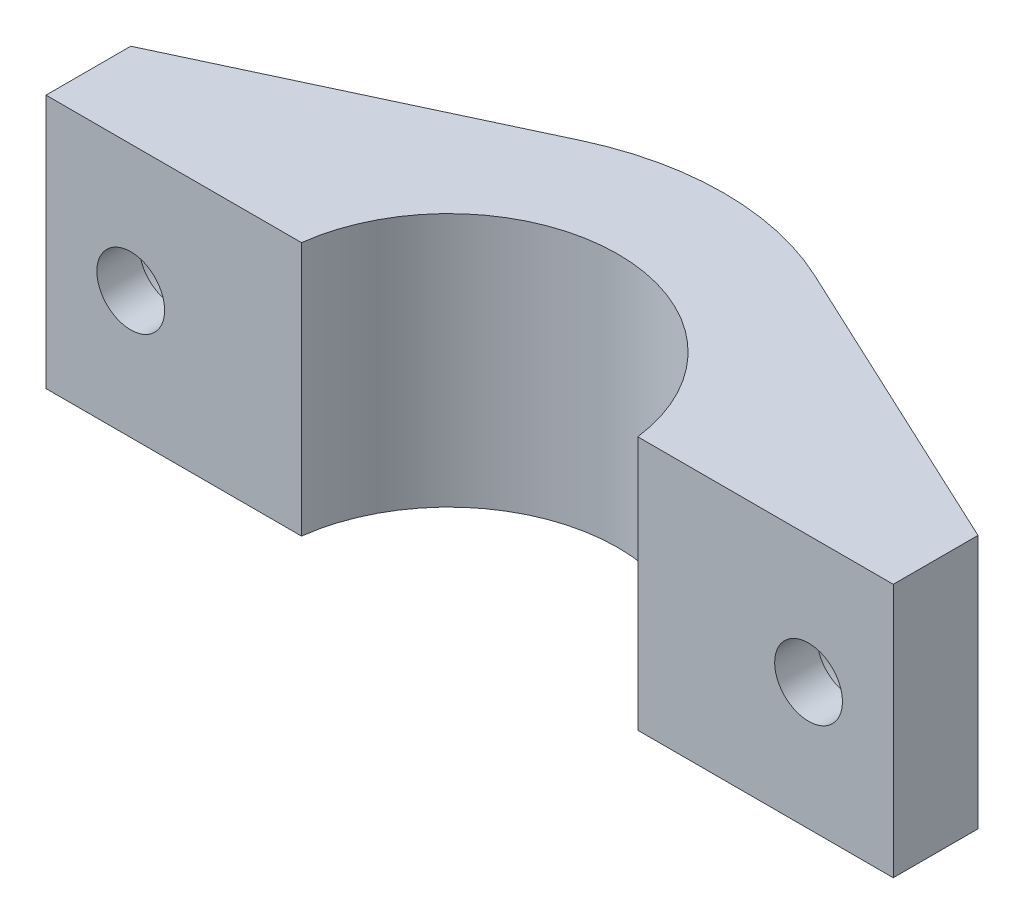
ISO-10303-21;
HEADER;
FILE_DESCRIPTION(('STEP AP214'),'2;1');
FILE_NAME('part.step','',(''),(''),'','','');
FILE_SCHEMA(('AUTOMOTIVE_DESIGN { 1 0 10303 214 1 1 1 1 }'));
ENDSEC;
DATA;
#1=APPLICATION_CONTEXT('core data for automotive mechanical design processes');
#2=APPLICATION_PROTOCOL_DEFINITION('international standard','automotive_design',2000,#1);
#3=PRODUCT_CONTEXT('',#1,'mechanical');
#4=PRODUCT('Part','Part','',(#3));
#5=PRODUCT_RELATED_PRODUCT_CATEGORY('part','',(#4));
#6=PRODUCT_DEFINITION_FORMATION('','',#4);
#7=PRODUCT_DEFINITION_CONTEXT('part definition',#1,'design');
#8=PRODUCT_DEFINITION('design','',#6,#7);
#9=PRODUCT_DEFINITION_SHAPE('','',#8);
#10=(LENGTH_UNIT() NAMED_UNIT(*) SI_UNIT(.MILLI.,.METRE.));
#11=(NAMED_UNIT(*) PLANE_ANGLE_UNIT() SI_UNIT($,.RADIAN.));
#12=(NAMED_UNIT(*) SI_UNIT($,.STERADIAN.) SOLID_ANGLE_UNIT());
#13=UNCERTAINTY_MEASURE_WITH_UNIT(LENGTH_MEASURE(1.E-05),#10,'distance_accuracy_value','');
#14=(GEOMETRIC_REPRESENTATION_CONTEXT(3) GLOBAL_UNCERTAINTY_ASSIGNED_CONTEXT((#13)) GLOBAL_UNIT_ASSIGNED_CONTEXT((#10,
#11,#12)) REPRESENTATION_CONTEXT('',''));
#15=CARTESIAN_POINT('',(0.,0.,0.));
#16=DIRECTION('',(0.,0.,1.));
#17=DIRECTION('',(1.,0.,0.));
#18=AXIS2_PLACEMENT_3D('',#15,#16,#17);
#19=CARTESIAN_POINT('',(0.,12.,-5.));
#20=DIRECTION('',(0.,0.,-1.));
#21=DIRECTION('',(-1.,0.,0.));
#22=AXIS2_PLACEMENT_3D('',#19,#20,#21);
#23=PLANE('',#22);
#24=DIRECTION('',(-1.,0.,0.));
#25=VECTOR('',#24,1.);
#26=CARTESIAN_POINT('',(20.,2.,-4.99999999999999));
#27=LINE('',#26,#25);
#28=CARTESIAN_POINT('',(20.,2.,-4.99999999999999));
#29=VERTEX_POINT('',#28);
#30=CARTESIAN_POINT('',(16.248076809272,2.,-5.));
#31=VERTEX_POINT('',#30);
#32=EDGE_CURVE('E335',#29,#31,#27,.T.);
#33=ORIENTED_EDGE('',*,*,#32,.T.);
#34=DIRECTION('',(0.,1.,0.));
#35=VECTOR('',#34,1.);
#36=CARTESIAN_POINT('',(16.248076809272,12.,-5.00000000000001));
#37=LINE('',#36,#35);
#38=CARTESIAN_POINT('',(16.248076809272,3.01027461182445,-5.00000000000001));
#39=VERTEX_POINT('',#38);
#40=EDGE_CURVE('E226',#31,#39,#37,.T.);
#41=ORIENTED_EDGE('',*,*,#40,.T.);
#42=CARTESIAN_POINT('',(16.,6.,-5.00000000000001));
#43=DIRECTION('',(0.,0.,-1.));
#44=DIRECTION('',(-1.,0.,0.));
#45=AXIS2_PLACEMENT_3D('',#42,#43,#44);
#46=CIRCLE('',#45,3.);
#47=CARTESIAN_POINT('',(16.248076809272,8.98972538817555,-5.00000000000001));
#48=VERTEX_POINT('',#47);
#49=EDGE_CURVE('E236',#48,#39,#46,.T.);
#50=ORIENTED_EDGE('',*,*,#49,.F.);
#51=DIRECTION('',(0.,1.,0.));
#52=VECTOR('',#51,1.);
#53=CARTESIAN_POINT('',(16.248076809272,12.,-5.00000000000001));
#54=LINE('',#53,#52);
#55=CARTESIAN_POINT('',(16.248076809272,10.,-5.));
#56=VERTEX_POINT('',#55);
#57=EDGE_CURVE('E224',#48,#56,#54,.T.);
#58=ORIENTED_EDGE('',*,*,#57,.T.);
#59=DIRECTION('',(-1.,0.,0.));
#60=VECTOR('',#59,1.);
#61=CARTESIAN_POINT('',(20.,10.,-4.99999999999999));
#62=LINE('',#61,#60);
#63=CARTESIAN_POINT('',(20.,10.,-5.00000000000001));
#64=VERTEX_POINT('',#63);
#65=EDGE_CURVE('E253',#64,#56,#62,.T.);
#66=ORIENTED_EDGE('',*,*,#65,.F.);
#67=DIRECTION('',(0.,-1.,0.));
#68=VECTOR('',#67,1.);
#69=CARTESIAN_POINT('',(20.,12.,-5.00000000000001));
#70=LINE('',#69,#68);
#71=EDGE_CURVE('E192',#64,#29,#70,.T.);
#72=ORIENTED_EDGE('',*,*,#71,.T.);
#73=EDGE_LOOP('',(#33,#41,#50,#58,#66,#72));
#74=FACE_BOUND('',#73,.T.);
#75=ADVANCED_FACE('F35',(#74),#23,.T.);
#76=CARTESIAN_POINT('',(0.,12.,-5.));
#77=DIRECTION('',(0.,0.,-1.));
#78=DIRECTION('',(-1.,0.,0.));
#79=AXIS2_PLACEMENT_3D('',#76,#77,#78);
#80=PLANE('',#79);
#81=DIRECTION('',(1.,0.,0.));
#82=VECTOR('',#81,1.);
#83=CARTESIAN_POINT('',(-20.,10.,-4.99999999999999));
#84=LINE('',#83,#82);
#85=CARTESIAN_POINT('',(-20.,10.,-4.99999999999999));
#86=VERTEX_POINT('',#85);
#87=CARTESIAN_POINT('',(-16.2480768092719,10.,-5.));
#88=VERTEX_POINT('',#87);
#89=EDGE_CURVE('E277',#86,#88,#84,.T.);
#90=ORIENTED_EDGE('',*,*,#89,.T.);
#91=DIRECTION('',(0.,-1.,0.));
#92=VECTOR('',#91,1.);
#93=CARTESIAN_POINT('',(-16.2480768092719,12.,-5.));
#94=LINE('',#93,#92);
#95=CARTESIAN_POINT('',(-16.2480768092719,8.98972538817555,-5.));
#96=VERTEX_POINT('',#95);
#97=EDGE_CURVE('E210',#88,#96,#94,.T.);
#98=ORIENTED_EDGE('',*,*,#97,.T.);
#99=CARTESIAN_POINT('',(-16.,6.,-5.));
#100=DIRECTION('',(0.,0.,-1.));
#101=DIRECTION('',(-1.,0.,0.));
#102=AXIS2_PLACEMENT_3D('',#99,#100,#101);
#103=CIRCLE('',#102,3.);
#104=CARTESIAN_POINT('',(-16.2480768092719,3.01027461182445,-5.));
#105=VERTEX_POINT('',#104);
#106=EDGE_CURVE('E291',#105,#96,#103,.T.);
#107=ORIENTED_EDGE('',*,*,#106,.F.);
#108=DIRECTION('',(0.,-1.,0.));
#109=VECTOR('',#108,1.);
#110=CARTESIAN_POINT('',(-16.2480768092719,12.,-5.));
#111=LINE('',#110,#109);
#112=CARTESIAN_POINT('',(-16.2480768092719,2.,-5.));
#113=VERTEX_POINT('',#112);
#114=EDGE_CURVE('E208',#105,#113,#111,.T.);
#115=ORIENTED_EDGE('',*,*,#114,.T.);
#116=DIRECTION('',(1.,0.,0.));
#117=VECTOR('',#116,1.);
#118=CARTESIAN_POINT('',(-20.,2.,-4.99999999999999));
#119=LINE('',#118,#117);
#120=CARTESIAN_POINT('',(-20.,2.,-4.99999999999999));
#121=VERTEX_POINT('',#120);
#122=EDGE_CURVE('E316',#121,#113,#119,.T.);
#123=ORIENTED_EDGE('',*,*,#122,.F.);
#124=DIRECTION('',(0.,-1.,0.));
#125=VECTOR('',#124,1.);
#126=CARTESIAN_POINT('',(-20.,12.,-4.99999999999999));
#127=LINE('',#126,#125);
#128=EDGE_CURVE('E191',#86,#121,#127,.T.);
#129=ORIENTED_EDGE('',*,*,#128,.F.);
#130=EDGE_LOOP('',(#90,#98,#107,#115,#123,#129));
#131=FACE_BOUND('',#130,.T.);
#132=ADVANCED_FACE('F373',(#131),#80,.T.);
#133=CARTESIAN_POINT('',(0.,12.,0.));
#134=DIRECTION('',(0.,-1.,0.));
#135=DIRECTION('',(0.,0.,-1.));
#136=AXIS2_PLACEMENT_3D('',#133,#134,#135);
#137=CYLINDRICAL_SURFACE('',#136,13.);
#138=CARTESIAN_POINT('',(0.,2.,0.));
#139=DIRECTION('',(0.,-1.,0.));
#140=DIRECTION('',(0.,0.,-1.));
#141=AXIS2_PLACEMENT_3D('',#138,#139,#140);
#142=CIRCLE('',#141,13.);
#143=CARTESIAN_POINT('',(-10.3036584644163,2.,-7.92682926829269));
#144=VERTEX_POINT('',#143);
#145=CARTESIAN_POINT('',(-5.50588235294118,2.,-11.7764705882353));
#146=VERTEX_POINT('',#145);
#147=EDGE_CURVE('E206',#144,#146,#142,.T.);
#148=ORIENTED_EDGE('',*,*,#147,.F.);
#149=DIRECTION('',(0.,-1.,0.));
#150=VECTOR('',#149,1.);
#151=CARTESIAN_POINT('',(-10.3036584644163,12.,-7.92682926829269));
#152=LINE('',#151,#150);
#153=CARTESIAN_POINT('',(-10.3036584644163,10.,-7.92682926829269));
#154=VERTEX_POINT('',#153);
#155=EDGE_CURVE('E218',#144,#154,#152,.F.);
#156=ORIENTED_EDGE('',*,*,#155,.T.);
#157=CARTESIAN_POINT('',(0.,10.,0.));
#158=DIRECTION('',(0.,1.,0.));
#159=DIRECTION('',(0.,0.,1.));
#160=AXIS2_PLACEMENT_3D('',#157,#158,#159);
#161=CIRCLE('',#160,13.);
#162=CARTESIAN_POINT('',(-5.50588235294118,10.,-11.7764705882353));
#163=VERTEX_POINT('',#162);
#164=EDGE_CURVE('E244',#163,#154,#161,.T.);
#165=ORIENTED_EDGE('',*,*,#164,.F.);
#166=DIRECTION('',(0.,1.,0.));
#167=VECTOR('',#166,1.);
#168=CARTESIAN_POINT('',(-5.50588235294118,10.,-11.7764705882353));
#169=LINE('',#168,#167);
#170=CARTESIAN_POINT('',(-5.50588235294118,12.,-11.7764705882353));
#171=VERTEX_POINT('',#170);
#172=EDGE_CURVE('E283',#163,#171,#169,.T.);
#173=ORIENTED_EDGE('',*,*,#172,.T.);
#174=CARTESIAN_POINT('',(0.,12.,0.));
#175=DIRECTION('',(0.,1.,0.));
#176=DIRECTION('',(0.,0.,1.));
#177=AXIS2_PLACEMENT_3D('',#174,#175,#176);
#178=CIRCLE('',#177,13.);
#179=CARTESIAN_POINT('',(5.50588235294118,12.,-11.7764705882353));
#180=VERTEX_POINT('',#179);
#181=EDGE_CURVE('E179',#180,#171,#178,.T.);
#182=ORIENTED_EDGE('',*,*,#181,.F.);
#183=DIRECTION('',(0.,1.,0.));
#184=VECTOR('',#183,1.);
#185=CARTESIAN_POINT('',(5.50588235294118,10.,-11.7764705882353));
#186=LINE('',#185,#184);
#187=CARTESIAN_POINT('',(5.50588235294118,10.,-11.7764705882353));
#188=VERTEX_POINT('',#187);
#189=EDGE_CURVE('E260',#188,#180,#186,.T.);
#190=ORIENTED_EDGE('',*,*,#189,.F.);
#191=CARTESIAN_POINT('',(0.,10.,0.));
#192=DIRECTION('',(0.,1.,0.));
#193=DIRECTION('',(0.,0.,1.));
#194=AXIS2_PLACEMENT_3D('',#191,#192,#193);
#195=CIRCLE('',#194,13.);
#196=CARTESIAN_POINT('',(10.3036584644163,10.,-7.9268292682927));
#197=VERTEX_POINT('',#196);
#198=EDGE_CURVE('E196',#197,#188,#195,.T.);
#199=ORIENTED_EDGE('',*,*,#198,.F.);
#200=DIRECTION('',(0.,-1.,0.));
#201=VECTOR('',#200,1.);
#202=CARTESIAN_POINT('',(10.3036584644163,12.,-7.9268292682927));
#203=LINE('',#202,#201);
#204=CARTESIAN_POINT('',(10.3036584644163,2.,-7.9268292682927));
#205=VERTEX_POINT('',#204);
#206=EDGE_CURVE('E215',#197,#205,#203,.T.);
#207=ORIENTED_EDGE('',*,*,#206,.T.);
#208=CARTESIAN_POINT('',(0.,2.,0.));
#209=DIRECTION('',(0.,-1.,0.));
#210=DIRECTION('',(0.,0.,-1.));
#211=AXIS2_PLACEMENT_3D('',#208,#209,#210);
#212=CIRCLE('',#211,13.);
#213=CARTESIAN_POINT('',(5.50588235294118,2.,-11.7764705882353));
#214=VERTEX_POINT('',#213);
#215=EDGE_CURVE('E317',#214,#205,#212,.T.);
#216=ORIENTED_EDGE('',*,*,#215,.F.);
#217=DIRECTION('',(0.,-1.,0.));
#218=VECTOR('',#217,1.);
#219=CARTESIAN_POINT('',(5.50588235294118,2.,-11.7764705882353));
#220=LINE('',#219,#218);
#221=CARTESIAN_POINT('',(5.50588235294118,0.,-11.7764705882353));
#222=VERTEX_POINT('',#221);
#223=EDGE_CURVE('E329',#214,#222,#220,.T.);
#224=ORIENTED_EDGE('',*,*,#223,.T.);
#225=CARTESIAN_POINT('',(0.,0.,0.));
#226=DIRECTION('',(0.,1.,0.));
#227=DIRECTION('',(0.,0.,1.));
#228=AXIS2_PLACEMENT_3D('',#225,#226,#227);
#229=CIRCLE('',#228,13.);
#230=CARTESIAN_POINT('',(-5.50588235294118,0.,-11.7764705882353));
#231=VERTEX_POINT('',#230);
#232=EDGE_CURVE('E204',#222,#231,#229,.T.);
#233=ORIENTED_EDGE('',*,*,#232,.T.);
#234=DIRECTION('',(0.,-1.,0.));
#235=VECTOR('',#234,1.);
#236=CARTESIAN_POINT('',(-5.50588235294118,2.,-11.7764705882353));
#237=LINE('',#236,#235);
#238=EDGE_CURVE('E275',#146,#231,#237,.T.);
#239=ORIENTED_EDGE('',*,*,#238,.F.);
#240=EDGE_LOOP('',(#148,#156,#165,#173,#182,#190,#199,#207,#216,#224,#233,#239));
#241=FACE_BOUND('',#240,.T.);
#242=ADVANCED_FACE('F256',(#241),#137,.T.);
#243=CARTESIAN_POINT('',(16.,6.,6.99999999999999));
#244=DIRECTION('',(0.,0.,-1.));
#245=DIRECTION('',(-1.,0.,0.));
#246=AXIS2_PLACEMENT_3D('',#243,#244,#245);
#247=CYLINDRICAL_SURFACE('',#246,1.6);
#248=CARTESIAN_POINT('',(16.,6.,-0.999999999999999));
#249=DIRECTION('',(0.,0.,-1.));
#250=DIRECTION('',(-1.,0.,0.));
#251=AXIS2_PLACEMENT_3D('',#248,#249,#250);
#252=CIRCLE('',#251,1.6);
#253=CARTESIAN_POINT('',(14.4,6.,-0.999999999999999));
#254=VERTEX_POINT('',#253);
#255=EDGE_CURVE('E336',#254,#254,#252,.F.);
#256=ORIENTED_EDGE('',*,*,#255,.T.);
#257=EDGE_LOOP('',(#256));
#258=FACE_BOUND('',#257,.T.);
#259=CARTESIAN_POINT('',(16.,6.,-3.00000000000001));
#260=DIRECTION('',(0.,0.,-1.));
#261=DIRECTION('',(-1.,0.,0.));
#262=AXIS2_PLACEMENT_3D('',#259,#260,#261);
#263=CIRCLE('',#262,1.6);
#264=CARTESIAN_POINT('',(14.4,6.,-3.00000000000001));
#265=VERTEX_POINT('',#264);
#266=EDGE_CURVE('E200',#265,#265,#263,.F.);
#267=ORIENTED_EDGE('',*,*,#266,.F.);
#268=EDGE_LOOP('',(#267));
#269=FACE_BOUND('',#268,.T.);
#270=ADVANCED_FACE('F483',(#258,#269),#247,.F.);
#271=CARTESIAN_POINT('',(-16.,6.,7.));
#272=DIRECTION('',(0.,0.,-1.));
#273=DIRECTION('',(-1.,0.,0.));
#274=AXIS2_PLACEMENT_3D('',#271,#272,#273);
#275=CYLINDRICAL_SURFACE('',#274,1.6);
#276=CARTESIAN_POINT('',(-16.,6.,-1.));
#277=DIRECTION('',(0.,0.,-1.));
#278=DIRECTION('',(-1.,0.,0.));
#279=AXIS2_PLACEMENT_3D('',#276,#277,#278);
#280=CIRCLE('',#279,1.6);
#281=CARTESIAN_POINT('',(-17.6,6.,-1.));
#282=VERTEX_POINT('',#281);
#283=EDGE_CURVE('E342',#282,#282,#280,.F.);
#284=ORIENTED_EDGE('',*,*,#283,.T.);
#285=EDGE_LOOP('',(#284));
#286=FACE_BOUND('',#285,.T.);
#287=CARTESIAN_POINT('',(-16.,6.,-3.));
#288=DIRECTION('',(0.,0.,-1.));
#289=DIRECTION('',(-1.,0.,0.));
#290=AXIS2_PLACEMENT_3D('',#287,#288,#289);
#291=CIRCLE('',#290,1.6);
#292=CARTESIAN_POINT('',(-17.6,6.,-3.));
#293=VERTEX_POINT('',#292);
#294=EDGE_CURVE('E197',#293,#293,#291,.F.);
#295=ORIENTED_EDGE('',*,*,#294,.F.);
#296=EDGE_LOOP('',(#295));
#297=FACE_BOUND('',#296,.T.);
#298=ADVANCED_FACE('F474',(#286,#297),#275,.F.);
#299=CARTESIAN_POINT('',(-20.,12.,0.));
#300=DIRECTION('',(-1.,0.,0.));
#301=DIRECTION('',(0.,0.,1.));
#302=AXIS2_PLACEMENT_3D('',#299,#300,#301);
#303=PLANE('',#302);
#304=DIRECTION('',(0.,-1.,0.));
#305=VECTOR('',#304,1.);
#306=CARTESIAN_POINT('',(-20.,20.,-1.00000000000001));
#307=LINE('',#306,#305);
#308=CARTESIAN_POINT('',(-20.,12.,-1.00000000000001));
#309=VERTEX_POINT('',#308);
#310=CARTESIAN_POINT('',(-20.,0.,-1.00000000000001));
#311=VERTEX_POINT('',#310);
#312=EDGE_CURVE('E50',#309,#311,#307,.T.);
#313=ORIENTED_EDGE('',*,*,#312,.F.);
#314=DIRECTION('',(0.,0.,-1.));
#315=VECTOR('',#314,1.);
#316=CARTESIAN_POINT('',(-20.,12.,0.));
#317=LINE('',#316,#315);
#318=CARTESIAN_POINT('',(-20.,12.,-4.99999999999999));
#319=VERTEX_POINT('',#318);
#320=EDGE_CURVE('E182',#309,#319,#317,.T.);
#321=ORIENTED_EDGE('',*,*,#320,.T.);
#322=EDGE_CURVE('E193',#319,#86,#127,.T.);
#323=ORIENTED_EDGE('',*,*,#322,.T.);
#324=ORIENTED_EDGE('',*,*,#128,.T.);
#325=DIRECTION('',(0.,-1.,0.));
#326=VECTOR('',#325,1.);
#327=CARTESIAN_POINT('',(-20.,2.,-4.99999999999999));
#328=LINE('',#327,#326);
#329=CARTESIAN_POINT('',(-20.,0.,-4.99999999999999));
#330=VERTEX_POINT('',#329);
#331=EDGE_CURVE('E313',#121,#330,#328,.T.);
#332=ORIENTED_EDGE('',*,*,#331,.T.);
#333=DIRECTION('',(0.,0.,-1.));
#334=VECTOR('',#333,1.);
#335=CARTESIAN_POINT('',(-20.,0.,0.));
#336=LINE('',#335,#334);
#337=EDGE_CURVE('E184',#311,#330,#336,.T.);
#338=ORIENTED_EDGE('',*,*,#337,.F.);
#339=EDGE_LOOP('',(#313,#321,#323,#324,#332,#338));
#340=FACE_BOUND('',#339,.T.);
#341=ADVANCED_FACE('F320',(#340),#303,.T.);
#342=CARTESIAN_POINT('',(0.,12.,0.));
#343=DIRECTION('',(0.,-1.,0.));
#344=DIRECTION('',(0.,0.,-1.));
#345=AXIS2_PLACEMENT_3D('',#342,#343,#344);
#346=CYLINDRICAL_SURFACE('',#345,8.);
#347=DIRECTION('',(0.,-1.,0.));
#348=VECTOR('',#347,1.);
#349=CARTESIAN_POINT('',(7.93725393319377,12.,-1.));
#350=LINE('',#349,#348);
#351=CARTESIAN_POINT('',(7.93725393319377,12.,-1.));
#352=VERTEX_POINT('',#351);
#353=CARTESIAN_POINT('',(7.93725393319377,0.,-1.));
#354=VERTEX_POINT('',#353);
#355=EDGE_CURVE('E58',#352,#354,#350,.T.);
#356=ORIENTED_EDGE('',*,*,#355,.F.);
#357=CARTESIAN_POINT('',(0.,12.,0.));
#358=DIRECTION('',(0.,1.,0.));
#359=DIRECTION('',(0.,0.,1.));
#360=AXIS2_PLACEMENT_3D('',#357,#358,#359);
#361=CIRCLE('',#360,8.);
#362=CARTESIAN_POINT('',(-7.93725393319377,12.,-1.));
#363=VERTEX_POINT('',#362);
#364=EDGE_CURVE('E297',#352,#363,#361,.T.);
#365=ORIENTED_EDGE('',*,*,#364,.T.);
#366=DIRECTION('',(0.,-1.,0.));
#367=VECTOR('',#366,1.);
#368=CARTESIAN_POINT('',(-7.93725393319377,12.,-1.));
#369=LINE('',#368,#367);
#370=CARTESIAN_POINT('',(-7.93725393319377,0.,-1.));
#371=VERTEX_POINT('',#370);
#372=EDGE_CURVE('E347',#371,#363,#369,.F.);
#373=ORIENTED_EDGE('',*,*,#372,.F.);
#374=CARTESIAN_POINT('',(0.,0.,0.));
#375=DIRECTION('',(0.,1.,0.));
#376=DIRECTION('',(0.,0.,1.));
#377=AXIS2_PLACEMENT_3D('',#374,#375,#376);
#378=CIRCLE('',#377,8.);
#379=EDGE_CURVE('E180',#354,#371,#378,.T.);
#380=ORIENTED_EDGE('',*,*,#379,.F.);
#381=EDGE_LOOP('',(#356,#365,#373,#380));
#382=FACE_BOUND('',#381,.T.);
#383=ADVANCED_FACE('F356',(#382),#346,.F.);
#384=CARTESIAN_POINT('',(20.,12.,0.));
#385=DIRECTION('',(1.,0.,0.));
#386=DIRECTION('',(0.,0.,-1.));
#387=AXIS2_PLACEMENT_3D('',#384,#385,#386);
#388=PLANE('',#387);
#389=DIRECTION('',(0.,-1.,0.));
#390=VECTOR('',#389,1.);
#391=CARTESIAN_POINT('',(20.,20.,-1.));
#392=LINE('',#391,#390);
#393=CARTESIAN_POINT('',(20.,12.,-1.));
#394=VERTEX_POINT('',#393);
#395=CARTESIAN_POINT('',(20.,0.,-1.));
#396=VERTEX_POINT('',#395);
#397=EDGE_CURVE('E159',#394,#396,#392,.T.);
#398=ORIENTED_EDGE('',*,*,#397,.T.);
#399=DIRECTION('',(0.,0.,1.));
#400=VECTOR('',#399,1.);
#401=CARTESIAN_POINT('',(20.,0.,0.));
#402=LINE('',#401,#400);
#403=CARTESIAN_POINT('',(20.,0.,-5.00000000000001));
#404=VERTEX_POINT('',#403);
#405=EDGE_CURVE('E170',#404,#396,#402,.T.);
#406=ORIENTED_EDGE('',*,*,#405,.F.);
#407=DIRECTION('',(0.,-1.,0.));
#408=VECTOR('',#407,1.);
#409=CARTESIAN_POINT('',(20.,2.,-4.99999999999999));
#410=LINE('',#409,#408);
#411=EDGE_CURVE('E328',#29,#404,#410,.T.);
#412=ORIENTED_EDGE('',*,*,#411,.F.);
#413=ORIENTED_EDGE('',*,*,#71,.F.);
#414=CARTESIAN_POINT('',(20.,12.,-4.99999999999999));
#415=VERTEX_POINT('',#414);
#416=EDGE_CURVE('E188',#415,#64,#70,.T.);
#417=ORIENTED_EDGE('',*,*,#416,.F.);
#418=DIRECTION('',(0.,0.,1.));
#419=VECTOR('',#418,1.);
#420=CARTESIAN_POINT('',(20.,12.,0.));
#421=LINE('',#420,#419);
#422=EDGE_CURVE('E172',#415,#394,#421,.T.);
#423=ORIENTED_EDGE('',*,*,#422,.T.);
#424=EDGE_LOOP('',(#398,#406,#412,#413,#417,#423));
#425=FACE_BOUND('',#424,.T.);
#426=ADVANCED_FACE('F168',(#425),#388,.T.);
#427=CARTESIAN_POINT('',(0.,12.,0.));
#428=DIRECTION('',(0.,1.,0.));
#429=DIRECTION('',(0.,0.,1.));
#430=AXIS2_PLACEMENT_3D('',#427,#428,#429);
#431=PLANE('',#430);
#432=DIRECTION('',(-1.,0.,0.));
#433=VECTOR('',#432,1.);
#434=CARTESIAN_POINT('',(0.,12.,-1.));
#435=LINE('',#434,#433);
#436=EDGE_CURVE('E346',#394,#352,#435,.T.);
#437=ORIENTED_EDGE('',*,*,#436,.F.);
#438=ORIENTED_EDGE('',*,*,#422,.F.);
#439=DIRECTION('',(0.905882352941176,0.,0.423529411764706));
#440=VECTOR('',#439,1.);
#441=CARTESIAN_POINT('',(20.,12.,-4.99999999999999));
#442=LINE('',#441,#440);
#443=EDGE_CURVE('E271',#180,#415,#442,.T.);
#444=ORIENTED_EDGE('',*,*,#443,.F.);
#445=ORIENTED_EDGE('',*,*,#181,.T.);
#446=DIRECTION('',(-0.905882352941176,0.,0.423529411764706));
#447=VECTOR('',#446,1.);
#448=CARTESIAN_POINT('',(-20.,12.,-4.99999999999999));
#449=LINE('',#448,#447);
#450=EDGE_CURVE('E266',#171,#319,#449,.T.);
#451=ORIENTED_EDGE('',*,*,#450,.T.);
#452=ORIENTED_EDGE('',*,*,#320,.F.);
#453=EDGE_CURVE('E173',#363,#309,#435,.T.);
#454=ORIENTED_EDGE('',*,*,#453,.F.);
#455=ORIENTED_EDGE('',*,*,#364,.F.);
#456=EDGE_LOOP('',(#437,#438,#444,#445,#451,#452,#454,#455));
#457=FACE_BOUND('',#456,.T.);
#458=ADVANCED_FACE('F359',(#457),#431,.T.);
#459=CARTESIAN_POINT('',(0.,0.,0.));
#460=DIRECTION('',(0.,1.,0.));
#461=DIRECTION('',(0.,0.,1.));
#462=AXIS2_PLACEMENT_3D('',#459,#460,#461);
#463=PLANE('',#462);
#464=ORIENTED_EDGE('',*,*,#405,.T.);
#465=DIRECTION('',(-1.,0.,0.));
#466=VECTOR('',#465,1.);
#467=CARTESIAN_POINT('',(0.,0.,-1.));
#468=LINE('',#467,#466);
#469=EDGE_CURVE('E11',#396,#354,#468,.T.);
#470=ORIENTED_EDGE('',*,*,#469,.T.);
#471=ORIENTED_EDGE('',*,*,#379,.T.);
#472=DIRECTION('',(1.,0.,0.));
#473=VECTOR('',#472,1.);
#474=CARTESIAN_POINT('',(20.,0.,-1.));
#475=LINE('',#474,#473);
#476=EDGE_CURVE('E305',#311,#371,#475,.T.);
#477=ORIENTED_EDGE('',*,*,#476,.F.);
#478=ORIENTED_EDGE('',*,*,#337,.T.);
#479=DIRECTION('',(-0.905882352941176,0.,0.423529411764706));
#480=VECTOR('',#479,1.);
#481=CARTESIAN_POINT('',(-20.,0.,-4.99999999999999));
#482=LINE('',#481,#480);
#483=EDGE_CURVE('E304',#231,#330,#482,.T.);
#484=ORIENTED_EDGE('',*,*,#483,.F.);
#485=ORIENTED_EDGE('',*,*,#232,.F.);
#486=DIRECTION('',(0.905882352941176,0.,0.423529411764706));
#487=VECTOR('',#486,1.);
#488=CARTESIAN_POINT('',(20.,0.,-4.99999999999999));
#489=LINE('',#488,#487);
#490=EDGE_CURVE('E177',#222,#404,#489,.T.);
#491=ORIENTED_EDGE('',*,*,#490,.T.);
#492=EDGE_LOOP('',(#464,#470,#471,#477,#478,#484,#485,#491));
#493=FACE_BOUND('',#492,.T.);
#494=ADVANCED_FACE('F175',(#493),#463,.F.);
#495=CARTESIAN_POINT('',(-16.,6.,-3.));
#496=DIRECTION('',(0.,0.,-1.));
#497=DIRECTION('',(-1.,0.,0.));
#498=AXIS2_PLACEMENT_3D('',#495,#496,#497);
#499=PLANE('',#498);
#500=CARTESIAN_POINT('',(-16.,6.,-3.));
#501=DIRECTION('',(0.,0.,-1.));
#502=DIRECTION('',(-1.,0.,0.));
#503=AXIS2_PLACEMENT_3D('',#500,#501,#502);
#504=CIRCLE('',#503,3.);
#505=CARTESIAN_POINT('',(-19.,6.,-2.99999999999999));
#506=VERTEX_POINT('',#505);
#507=EDGE_CURVE('E201',#506,#506,#504,.T.);
#508=ORIENTED_EDGE('',*,*,#507,.T.);
#509=EDGE_LOOP('',(#508));
#510=FACE_BOUND('',#509,.T.);
#511=ORIENTED_EDGE('',*,*,#294,.T.);
#512=EDGE_LOOP('',(#511));
#513=FACE_BOUND('',#512,.T.);
#514=ADVANCED_FACE('F433',(#510,#513),#499,.T.);
#515=CARTESIAN_POINT('',(-16.,6.,-3.));
#516=DIRECTION('',(0.,0.,-1.));
#517=DIRECTION('',(-1.,0.,0.));
#518=AXIS2_PLACEMENT_3D('',#515,#516,#517);
#519=CYLINDRICAL_SURFACE('',#518,3.);
#520=ORIENTED_EDGE('',*,*,#507,.F.);
#521=EDGE_LOOP('',(#520));
#522=FACE_BOUND('',#521,.T.);
#523=ORIENTED_EDGE('',*,*,#106,.T.);
#524=CARTESIAN_POINT('',(-16.,6.,-5.12214457732271));
#525=DIRECTION('',(0.441726104299386,0.,0.897149958914611));
#526=DIRECTION('',(0.897149958914611,0.,-0.441726104299386));
#527=AXIS2_PLACEMENT_3D('',#524,#525,#526);
#528=ELLIPSE('',#527,3.34392257413628,3.);
#529=EDGE_CURVE('E230',#96,#105,#528,.F.);
#530=ORIENTED_EDGE('',*,*,#529,.T.);
#531=EDGE_LOOP('',(#523,#530));
#532=FACE_BOUND('',#531,.T.);
#533=ADVANCED_FACE('F381',(#522,#532),#519,.F.);
#534=CARTESIAN_POINT('',(16.,6.,-3.00000000000001));
#535=DIRECTION('',(0.,0.,-1.));
#536=DIRECTION('',(-1.,0.,0.));
#537=AXIS2_PLACEMENT_3D('',#534,#535,#536);
#538=PLANE('',#537);
#539=CARTESIAN_POINT('',(16.,6.,-3.00000000000001));
#540=DIRECTION('',(0.,0.,-1.));
#541=DIRECTION('',(-1.,0.,0.));
#542=AXIS2_PLACEMENT_3D('',#539,#540,#541);
#543=CIRCLE('',#542,3.);
#544=CARTESIAN_POINT('',(13.,6.,-3.00000000000001));
#545=VERTEX_POINT('',#544);
#546=EDGE_CURVE('E243',#545,#545,#543,.T.);
#547=ORIENTED_EDGE('',*,*,#546,.T.);
#548=EDGE_LOOP('',(#547));
#549=FACE_BOUND('',#548,.T.);
#550=ORIENTED_EDGE('',*,*,#266,.T.);
#551=EDGE_LOOP('',(#550));
#552=FACE_BOUND('',#551,.T.);
#553=ADVANCED_FACE('F543',(#549,#552),#538,.T.);
#554=CARTESIAN_POINT('',(16.,6.,-3.00000000000001));
#555=DIRECTION('',(0.,0.,-1.));
#556=DIRECTION('',(-1.,0.,0.));
#557=AXIS2_PLACEMENT_3D('',#554,#555,#556);
#558=CYLINDRICAL_SURFACE('',#557,3.);
#559=ORIENTED_EDGE('',*,*,#546,.F.);
#560=EDGE_LOOP('',(#559));
#561=FACE_BOUND('',#560,.T.);
#562=ORIENTED_EDGE('',*,*,#49,.T.);
#563=CARTESIAN_POINT('',(16.,6.,-5.12214457732273));
#564=DIRECTION('',(-0.441726104299385,0.,0.897149958914611));
#565=DIRECTION('',(-0.897149958914611,0.,-0.441726104299385));
#566=AXIS2_PLACEMENT_3D('',#563,#564,#565);
#567=ELLIPSE('',#566,3.34392257413628,3.);
#568=EDGE_CURVE('E43',#39,#48,#567,.F.);
#569=ORIENTED_EDGE('',*,*,#568,.T.);
#570=EDGE_LOOP('',(#562,#569));
#571=FACE_BOUND('',#570,.T.);
#572=ADVANCED_FACE('F235',(#561,#571),#558,.F.);
#573=CARTESIAN_POINT('',(0.,10.,0.));
#574=DIRECTION('',(0.,1.,0.));
#575=DIRECTION('',(0.,0.,1.));
#576=AXIS2_PLACEMENT_3D('',#573,#574,#575);
#577=PLANE('',#576);
#578=ORIENTED_EDGE('',*,*,#164,.T.);
#579=DIRECTION('',(-0.897149958914611,0.,0.441726104299386));
#580=VECTOR('',#579,1.);
#581=CARTESIAN_POINT('',(-16.2480768092719,10.,-5.));
#582=LINE('',#581,#580);
#583=EDGE_CURVE('E220',#154,#88,#582,.T.);
#584=ORIENTED_EDGE('',*,*,#583,.T.);
#585=ORIENTED_EDGE('',*,*,#89,.F.);
#586=DIRECTION('',(-0.905882352941176,0.,0.423529411764706));
#587=VECTOR('',#586,1.);
#588=CARTESIAN_POINT('',(-20.,10.,-4.99999999999999));
#589=LINE('',#588,#587);
#590=EDGE_CURVE('E280',#163,#86,#589,.T.);
#591=ORIENTED_EDGE('',*,*,#590,.F.);
#592=EDGE_LOOP('',(#578,#584,#585,#591));
#593=FACE_BOUND('',#592,.T.);
#594=ADVANCED_FACE('F369',(#593),#577,.F.);
#595=CARTESIAN_POINT('',(-20.,10.,-4.99999999999999));
#596=DIRECTION('',(-0.423529411764706,0.,-0.905882352941176));
#597=DIRECTION('',(-0.905882352941176,0.,0.423529411764706));
#598=AXIS2_PLACEMENT_3D('',#595,#596,#597);
#599=PLANE('',#598);
#600=ORIENTED_EDGE('',*,*,#450,.F.);
#601=ORIENTED_EDGE('',*,*,#172,.F.);
#602=ORIENTED_EDGE('',*,*,#590,.T.);
#603=ORIENTED_EDGE('',*,*,#322,.F.);
#604=EDGE_LOOP('',(#600,#601,#602,#603));
#605=FACE_BOUND('',#604,.T.);
#606=ADVANCED_FACE('F365',(#605),#599,.T.);
#607=CARTESIAN_POINT('',(20.,10.,-4.99999999999999));
#608=DIRECTION('',(-0.423529411764706,0.,0.905882352941176));
#609=DIRECTION('',(0.905882352941176,0.,0.423529411764706));
#610=AXIS2_PLACEMENT_3D('',#607,#608,#609);
#611=PLANE('',#610);
#612=ORIENTED_EDGE('',*,*,#443,.T.);
#613=ORIENTED_EDGE('',*,*,#416,.T.);
#614=DIRECTION('',(0.905882352941176,0.,0.423529411764706));
#615=VECTOR('',#614,1.);
#616=CARTESIAN_POINT('',(20.,10.,-4.99999999999999));
#617=LINE('',#616,#615);
#618=EDGE_CURVE('E267',#188,#64,#617,.T.);
#619=ORIENTED_EDGE('',*,*,#618,.F.);
#620=ORIENTED_EDGE('',*,*,#189,.T.);
#621=EDGE_LOOP('',(#612,#613,#619,#620));
#622=FACE_BOUND('',#621,.T.);
#623=ADVANCED_FACE('F269',(#622),#611,.F.);
#624=CARTESIAN_POINT('',(0.,10.,0.));
#625=DIRECTION('',(0.,1.,0.));
#626=DIRECTION('',(0.,0.,1.));
#627=AXIS2_PLACEMENT_3D('',#624,#625,#626);
#628=PLANE('',#627);
#629=ORIENTED_EDGE('',*,*,#65,.T.);
#630=DIRECTION('',(-0.897149958914611,0.,-0.441726104299385));
#631=VECTOR('',#630,1.);
#632=CARTESIAN_POINT('',(10.3036584644163,10.,-7.9268292682927));
#633=LINE('',#632,#631);
#634=EDGE_CURVE('E228',#56,#197,#633,.T.);
#635=ORIENTED_EDGE('',*,*,#634,.T.);
#636=ORIENTED_EDGE('',*,*,#198,.T.);
#637=ORIENTED_EDGE('',*,*,#618,.T.);
#638=EDGE_LOOP('',(#629,#635,#636,#637));
#639=FACE_BOUND('',#638,.T.);
#640=ADVANCED_FACE('F250',(#639),#628,.F.);
#641=CARTESIAN_POINT('',(-20.,2.,-4.99999999999999));
#642=DIRECTION('',(0.423529411764706,0.,0.905882352941176));
#643=DIRECTION('',(0.905882352941176,0.,-0.423529411764706));
#644=AXIS2_PLACEMENT_3D('',#641,#642,#643);
#645=PLANE('',#644);
#646=ORIENTED_EDGE('',*,*,#483,.T.);
#647=ORIENTED_EDGE('',*,*,#331,.F.);
#648=DIRECTION('',(-0.905882352941176,0.,0.423529411764706));
#649=VECTOR('',#648,1.);
#650=CARTESIAN_POINT('',(-20.,2.,-4.99999999999999));
#651=LINE('',#650,#649);
#652=EDGE_CURVE('E321',#146,#121,#651,.T.);
#653=ORIENTED_EDGE('',*,*,#652,.F.);
#654=ORIENTED_EDGE('',*,*,#238,.T.);
#655=EDGE_LOOP('',(#646,#647,#653,#654));
#656=FACE_BOUND('',#655,.T.);
#657=ADVANCED_FACE('F311',(#656),#645,.F.);
#658=CARTESIAN_POINT('',(0.,2.,0.));
#659=DIRECTION('',(0.,-1.,0.));
#660=DIRECTION('',(0.,0.,1.));
#661=AXIS2_PLACEMENT_3D('',#658,#659,#660);
#662=PLANE('',#661);
#663=ORIENTED_EDGE('',*,*,#122,.T.);
#664=DIRECTION('',(0.897149958914611,0.,-0.441726104299386));
#665=VECTOR('',#664,1.);
#666=CARTESIAN_POINT('',(-16.2480768092719,2.,-5.));
#667=LINE('',#666,#665);
#668=EDGE_CURVE('E213',#113,#144,#667,.T.);
#669=ORIENTED_EDGE('',*,*,#668,.T.);
#670=ORIENTED_EDGE('',*,*,#147,.T.);
#671=ORIENTED_EDGE('',*,*,#652,.T.);
#672=EDGE_LOOP('',(#663,#669,#670,#671));
#673=FACE_BOUND('',#672,.T.);
#674=ADVANCED_FACE('F383',(#673),#662,.F.);
#675=CARTESIAN_POINT('',(0.,2.,0.));
#676=DIRECTION('',(0.,-1.,0.));
#677=DIRECTION('',(0.,0.,1.));
#678=AXIS2_PLACEMENT_3D('',#675,#676,#677);
#679=PLANE('',#678);
#680=ORIENTED_EDGE('',*,*,#215,.T.);
#681=DIRECTION('',(0.897149958914611,0.,0.441726104299385));
#682=VECTOR('',#681,1.);
#683=CARTESIAN_POINT('',(10.3036584644163,2.,-7.9268292682927));
#684=LINE('',#683,#682);
#685=EDGE_CURVE('E222',#205,#31,#684,.T.);
#686=ORIENTED_EDGE('',*,*,#685,.T.);
#687=ORIENTED_EDGE('',*,*,#32,.F.);
#688=DIRECTION('',(0.905882352941176,0.,0.423529411764706));
#689=VECTOR('',#688,1.);
#690=CARTESIAN_POINT('',(20.,2.,-4.99999999999999));
#691=LINE('',#690,#689);
#692=EDGE_CURVE('E332',#214,#29,#691,.T.);
#693=ORIENTED_EDGE('',*,*,#692,.F.);
#694=EDGE_LOOP('',(#680,#686,#687,#693));
#695=FACE_BOUND('',#694,.T.);
#696=ADVANCED_FACE('F388',(#695),#679,.F.);
#697=CARTESIAN_POINT('',(20.,2.,-4.99999999999999));
#698=DIRECTION('',(0.423529411764706,0.,-0.905882352941176));
#699=DIRECTION('',(-0.905882352941176,0.,-0.423529411764706));
#700=AXIS2_PLACEMENT_3D('',#697,#698,#699);
#701=PLANE('',#700);
#702=ORIENTED_EDGE('',*,*,#490,.F.);
#703=ORIENTED_EDGE('',*,*,#223,.F.);
#704=ORIENTED_EDGE('',*,*,#692,.T.);
#705=ORIENTED_EDGE('',*,*,#411,.T.);
#706=EDGE_LOOP('',(#702,#703,#704,#705));
#707=FACE_BOUND('',#706,.T.);
#708=ADVANCED_FACE('F386',(#707),#701,.T.);
#709=CARTESIAN_POINT('',(-16.2480768092719,12.,-5.));
#710=DIRECTION('',(0.441726104299386,0.,0.897149958914611));
#711=DIRECTION('',(0.,-1.,0.));
#712=AXIS2_PLACEMENT_3D('',#709,#710,#711);
#713=PLANE('',#712);
#714=ORIENTED_EDGE('',*,*,#583,.F.);
#715=ORIENTED_EDGE('',*,*,#155,.F.);
#716=ORIENTED_EDGE('',*,*,#668,.F.);
#717=ORIENTED_EDGE('',*,*,#114,.F.);
#718=ORIENTED_EDGE('',*,*,#529,.F.);
#719=ORIENTED_EDGE('',*,*,#97,.F.);
#720=EDGE_LOOP('',(#714,#715,#716,#717,#718,#719));
#721=FACE_BOUND('',#720,.T.);
#722=ADVANCED_FACE('F376',(#721),#713,.F.);
#723=CARTESIAN_POINT('',(10.3036584644163,12.,-7.9268292682927));
#724=DIRECTION('',(-0.441726104299385,0.,0.897149958914611));
#725=DIRECTION('',(0.,-1.,0.));
#726=AXIS2_PLACEMENT_3D('',#723,#724,#725);
#727=PLANE('',#726);
#728=ORIENTED_EDGE('',*,*,#568,.F.);
#729=ORIENTED_EDGE('',*,*,#40,.F.);
#730=ORIENTED_EDGE('',*,*,#685,.F.);
#731=ORIENTED_EDGE('',*,*,#206,.F.);
#732=ORIENTED_EDGE('',*,*,#634,.F.);
#733=ORIENTED_EDGE('',*,*,#57,.F.);
#734=EDGE_LOOP('',(#728,#729,#730,#731,#732,#733));
#735=FACE_BOUND('',#734,.T.);
#736=ADVANCED_FACE('F37',(#735),#727,.F.);
#737=CARTESIAN_POINT('',(20.,20.,-1.));
#738=DIRECTION('',(0.,0.,-1.));
#739=DIRECTION('',(-1.,0.,0.));
#740=AXIS2_PLACEMENT_3D('',#737,#738,#739);
#741=PLANE('',#740);
#742=ORIENTED_EDGE('',*,*,#372,.T.);
#743=ORIENTED_EDGE('',*,*,#453,.T.);
#744=ORIENTED_EDGE('',*,*,#312,.T.);
#745=ORIENTED_EDGE('',*,*,#476,.T.);
#746=EDGE_LOOP('',(#742,#743,#744,#745));
#747=FACE_BOUND('',#746,.T.);
#748=ORIENTED_EDGE('',*,*,#283,.F.);
#749=EDGE_LOOP('',(#748));
#750=FACE_BOUND('',#749,.T.);
#751=ADVANCED_FACE('F352',(#747,#750),#741,.F.);
#752=ORIENTED_EDGE('',*,*,#355,.T.);
#753=ORIENTED_EDGE('',*,*,#469,.F.);
#754=ORIENTED_EDGE('',*,*,#397,.F.);
#755=ORIENTED_EDGE('',*,*,#436,.T.);
#756=EDGE_LOOP('',(#752,#753,#754,#755));
#757=FACE_BOUND('',#756,.T.);
#758=ORIENTED_EDGE('',*,*,#255,.F.);
#759=EDGE_LOOP('',(#758));
#760=FACE_BOUND('',#759,.T.);
#761=ADVANCED_FACE('F157',(#757,#760),#741,.F.);
#762=CLOSED_SHELL('',(#75,#132,#242,#270,#298,#341,#383,#426,#458,#494,#514,#533,#553,#572,#594,
#606,#623,#640,#657,#674,#696,#708,#722,#736,#751,#761));
#763=MANIFOLD_SOLID_BREP('B2',#762);
#764=ADVANCED_BREP_SHAPE_REPRESENTATION('',(#18,#763),#14);
#765=SHAPE_DEFINITION_REPRESENTATION(#9,#764);
ENDSEC;
END-ISO-10303-21;
